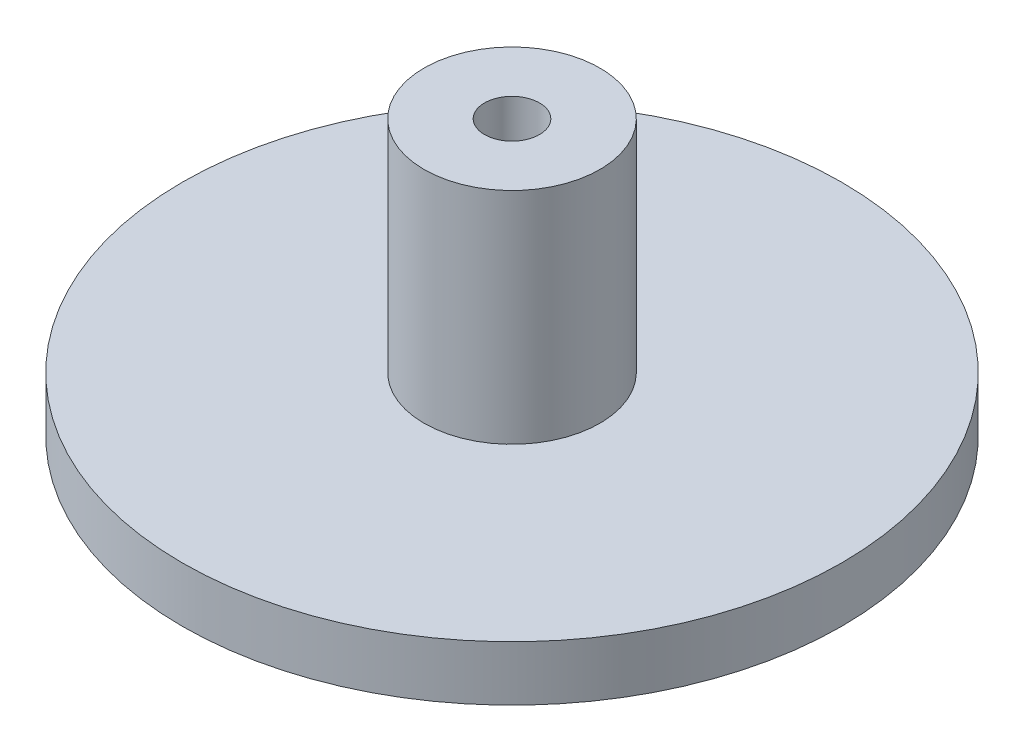
ISO-10303-21;
HEADER;
FILE_DESCRIPTION(('STEP AP214'),'2;1');
FILE_NAME('part.step','',(''),(''),'','','');
FILE_SCHEMA(('AUTOMOTIVE_DESIGN { 1 0 10303 214 1 1 1 1 }'));
ENDSEC;
DATA;
#1=APPLICATION_CONTEXT('core data for automotive mechanical design processes');
#2=APPLICATION_PROTOCOL_DEFINITION('international standard','automotive_design',2000,#1);
#3=PRODUCT_CONTEXT('',#1,'mechanical');
#4=PRODUCT('Part','Part','',(#3));
#5=PRODUCT_RELATED_PRODUCT_CATEGORY('part','',(#4));
#6=PRODUCT_DEFINITION_FORMATION('','',#4);
#7=PRODUCT_DEFINITION_CONTEXT('part definition',#1,'design');
#8=PRODUCT_DEFINITION('design','',#6,#7);
#9=PRODUCT_DEFINITION_SHAPE('','',#8);
#10=(LENGTH_UNIT() NAMED_UNIT(*) SI_UNIT(.MILLI.,.METRE.));
#11=(NAMED_UNIT(*) PLANE_ANGLE_UNIT() SI_UNIT($,.RADIAN.));
#12=(NAMED_UNIT(*) SI_UNIT($,.STERADIAN.) SOLID_ANGLE_UNIT());
#13=UNCERTAINTY_MEASURE_WITH_UNIT(LENGTH_MEASURE(1.E-05),#10,'distance_accuracy_value','');
#14=(GEOMETRIC_REPRESENTATION_CONTEXT(3) GLOBAL_UNCERTAINTY_ASSIGNED_CONTEXT((#13)) GLOBAL_UNIT_ASSIGNED_CONTEXT((#10,
#11,#12)) REPRESENTATION_CONTEXT('',''));
#15=CARTESIAN_POINT('',(0.,0.,0.));
#16=DIRECTION('',(0.,0.,1.));
#17=DIRECTION('',(1.,0.,0.));
#18=AXIS2_PLACEMENT_3D('',#15,#16,#17);
#19=CARTESIAN_POINT('',(0.,5.,0.));
#20=DIRECTION('',(0.,-1.,0.));
#21=DIRECTION('',(0.,0.,-1.));
#22=AXIS2_PLACEMENT_3D('',#19,#20,#21);
#23=CYLINDRICAL_SURFACE('',#22,30.);
#24=CARTESIAN_POINT('',(0.,5.,0.));
#25=DIRECTION('',(0.,1.,0.));
#26=DIRECTION('',(0.,0.,1.));
#27=AXIS2_PLACEMENT_3D('',#24,#25,#26);
#28=CIRCLE('',#27,30.);
#29=CARTESIAN_POINT('',(0.,5.,30.));
#30=VERTEX_POINT('',#29);
#31=EDGE_CURVE('E10',#30,#30,#28,.T.);
#32=ORIENTED_EDGE('',*,*,#31,.F.);
#33=EDGE_LOOP('',(#32));
#34=FACE_BOUND('',#33,.T.);
#35=CARTESIAN_POINT('',(0.,0.,0.));
#36=DIRECTION('',(0.,1.,0.));
#37=DIRECTION('',(0.,0.,1.));
#38=AXIS2_PLACEMENT_3D('',#35,#36,#37);
#39=CIRCLE('',#38,30.);
#40=CARTESIAN_POINT('',(0.,0.,30.));
#41=VERTEX_POINT('',#40);
#42=EDGE_CURVE('E36',#41,#41,#39,.T.);
#43=ORIENTED_EDGE('',*,*,#42,.T.);
#44=EDGE_LOOP('',(#43));
#45=FACE_BOUND('',#44,.T.);
#46=ADVANCED_FACE('F33',(#34,#45),#23,.T.);
#47=CARTESIAN_POINT('',(0.,5.,0.));
#48=DIRECTION('',(0.,1.,0.));
#49=DIRECTION('',(0.,0.,1.));
#50=AXIS2_PLACEMENT_3D('',#47,#48,#49);
#51=PLANE('',#50);
#52=CARTESIAN_POINT('',(0.,5.,0.));
#53=DIRECTION('',(0.,1.,0.));
#54=DIRECTION('',(0.,0.,1.));
#55=AXIS2_PLACEMENT_3D('',#52,#53,#54);
#56=CIRCLE('',#55,8.);
#57=CARTESIAN_POINT('',(0.,5.,8.));
#58=VERTEX_POINT('',#57);
#59=EDGE_CURVE('E45',#58,#58,#56,.T.);
#60=ORIENTED_EDGE('',*,*,#59,.F.);
#61=EDGE_LOOP('',(#60));
#62=FACE_BOUND('',#61,.T.);
#63=ORIENTED_EDGE('',*,*,#31,.T.);
#64=EDGE_LOOP('',(#63));
#65=FACE_BOUND('',#64,.T.);
#66=ADVANCED_FACE('F78',(#62,#65),#51,.T.);
#67=CARTESIAN_POINT('',(0.,0.,0.));
#68=DIRECTION('',(0.,1.,0.));
#69=DIRECTION('',(0.,0.,1.));
#70=AXIS2_PLACEMENT_3D('',#67,#68,#69);
#71=PLANE('',#70);
#72=CARTESIAN_POINT('',(0.,0.,0.));
#73=DIRECTION('',(0.,1.,0.));
#74=DIRECTION('',(0.,0.,1.));
#75=AXIS2_PLACEMENT_3D('',#72,#73,#74);
#76=CIRCLE('',#75,2.5);
#77=CARTESIAN_POINT('',(0.,0.,2.5));
#78=VERTEX_POINT('',#77);
#79=EDGE_CURVE('E48',#78,#78,#76,.T.);
#80=ORIENTED_EDGE('',*,*,#79,.T.);
#81=EDGE_LOOP('',(#80));
#82=FACE_BOUND('',#81,.T.);
#83=ORIENTED_EDGE('',*,*,#42,.F.);
#84=EDGE_LOOP('',(#83));
#85=FACE_BOUND('',#84,.T.);
#86=ADVANCED_FACE('F57',(#82,#85),#71,.F.);
#87=CARTESIAN_POINT('',(0.,25.,0.));
#88=DIRECTION('',(0.,-1.,0.));
#89=DIRECTION('',(0.,0.,-1.));
#90=AXIS2_PLACEMENT_3D('',#87,#88,#89);
#91=CYLINDRICAL_SURFACE('',#90,8.);
#92=CARTESIAN_POINT('',(0.,25.,0.));
#93=DIRECTION('',(0.,1.,0.));
#94=DIRECTION('',(0.,0.,1.));
#95=AXIS2_PLACEMENT_3D('',#92,#93,#94);
#96=CIRCLE('',#95,8.);
#97=CARTESIAN_POINT('',(0.,25.,8.));
#98=VERTEX_POINT('',#97);
#99=EDGE_CURVE('E43',#98,#98,#96,.T.);
#100=ORIENTED_EDGE('',*,*,#99,.F.);
#101=EDGE_LOOP('',(#100));
#102=FACE_BOUND('',#101,.T.);
#103=ORIENTED_EDGE('',*,*,#59,.T.);
#104=EDGE_LOOP('',(#103));
#105=FACE_BOUND('',#104,.T.);
#106=ADVANCED_FACE('F69',(#102,#105),#91,.T.);
#107=CARTESIAN_POINT('',(0.,25.,0.));
#108=DIRECTION('',(0.,1.,0.));
#109=DIRECTION('',(0.,0.,1.));
#110=AXIS2_PLACEMENT_3D('',#107,#108,#109);
#111=PLANE('',#110);
#112=CARTESIAN_POINT('',(0.,25.,0.));
#113=DIRECTION('',(0.,1.,0.));
#114=DIRECTION('',(0.,0.,1.));
#115=AXIS2_PLACEMENT_3D('',#112,#113,#114);
#116=CIRCLE('',#115,2.5);
#117=CARTESIAN_POINT('',(0.,25.,2.5));
#118=VERTEX_POINT('',#117);
#119=EDGE_CURVE('E51',#118,#118,#116,.T.);
#120=ORIENTED_EDGE('',*,*,#119,.F.);
#121=EDGE_LOOP('',(#120));
#122=FACE_BOUND('',#121,.T.);
#123=ORIENTED_EDGE('',*,*,#99,.T.);
#124=EDGE_LOOP('',(#123));
#125=FACE_BOUND('',#124,.T.);
#126=ADVANCED_FACE('F63',(#122,#125),#111,.T.);
#127=CARTESIAN_POINT('',(0.,0.,0.));
#128=DIRECTION('',(0.,1.,0.));
#129=DIRECTION('',(0.,0.,1.));
#130=AXIS2_PLACEMENT_3D('',#127,#128,#129);
#131=CYLINDRICAL_SURFACE('',#130,2.5);
#132=ORIENTED_EDGE('',*,*,#79,.F.);
#133=EDGE_LOOP('',(#132));
#134=FACE_BOUND('',#133,.T.);
#135=ORIENTED_EDGE('',*,*,#119,.T.);
#136=EDGE_LOOP('',(#135));
#137=FACE_BOUND('',#136,.T.);
#138=ADVANCED_FACE('F60',(#134,#137),#131,.F.);
#139=CLOSED_SHELL('',(#46,#66,#86,#106,#126,#138));
#140=MANIFOLD_SOLID_BREP('B2',#139);
#141=ADVANCED_BREP_SHAPE_REPRESENTATION('',(#18,#140),#14);
#142=SHAPE_DEFINITION_REPRESENTATION(#9,#141);
ENDSEC;
END-ISO-10303-21;
